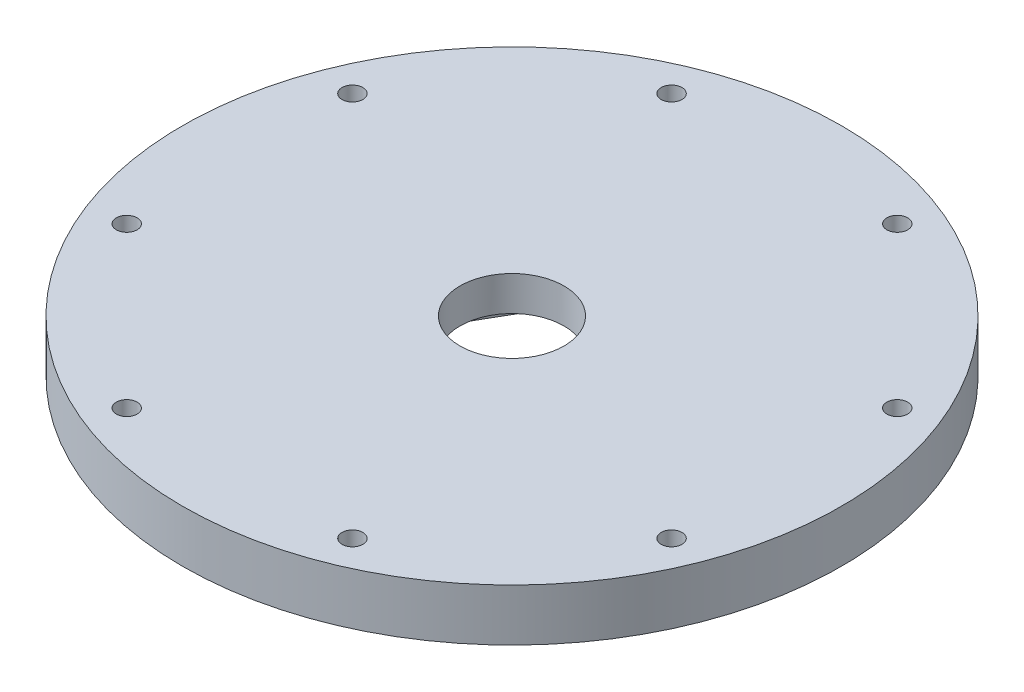
ISO-10303-21;
HEADER;
FILE_DESCRIPTION(('STEP AP214'),'2;1');
FILE_NAME('part.step','',(''),(''),'','','');
FILE_SCHEMA(('AUTOMOTIVE_DESIGN { 1 0 10303 214 1 1 1 1 }'));
ENDSEC;
DATA;
#1=APPLICATION_CONTEXT('core data for automotive mechanical design processes');
#2=APPLICATION_PROTOCOL_DEFINITION('international standard','automotive_design',2000,#1);
#3=PRODUCT_CONTEXT('',#1,'mechanical');
#4=PRODUCT('Part','Part','',(#3));
#5=PRODUCT_RELATED_PRODUCT_CATEGORY('part','',(#4));
#6=PRODUCT_DEFINITION_FORMATION('','',#4);
#7=PRODUCT_DEFINITION_CONTEXT('part definition',#1,'design');
#8=PRODUCT_DEFINITION('design','',#6,#7);
#9=PRODUCT_DEFINITION_SHAPE('','',#8);
#10=(LENGTH_UNIT() NAMED_UNIT(*) SI_UNIT(.MILLI.,.METRE.));
#11=(NAMED_UNIT(*) PLANE_ANGLE_UNIT() SI_UNIT($,.RADIAN.));
#12=(NAMED_UNIT(*) SI_UNIT($,.STERADIAN.) SOLID_ANGLE_UNIT());
#13=UNCERTAINTY_MEASURE_WITH_UNIT(LENGTH_MEASURE(1.E-05),#10,'distance_accuracy_value','');
#14=(GEOMETRIC_REPRESENTATION_CONTEXT(3) GLOBAL_UNCERTAINTY_ASSIGNED_CONTEXT((#13)) GLOBAL_UNIT_ASSIGNED_CONTEXT((#10,
#11,#12)) REPRESENTATION_CONTEXT('',''));
#15=CARTESIAN_POINT('',(0.,0.,0.));
#16=DIRECTION('',(0.,0.,1.));
#17=DIRECTION('',(1.,0.,0.));
#18=AXIS2_PLACEMENT_3D('',#15,#16,#17);
#19=CARTESIAN_POINT('',(0.,7.75,0.));
#20=DIRECTION('',(0.,-1.,0.));
#21=DIRECTION('',(0.,0.,-1.));
#22=AXIS2_PLACEMENT_3D('',#19,#20,#21);
#23=CYLINDRICAL_SURFACE('',#22,47.5);
#24=CARTESIAN_POINT('',(0.,7.75,0.));
#25=DIRECTION('',(0.,1.,0.));
#26=DIRECTION('',(0.,0.,1.));
#27=AXIS2_PLACEMENT_3D('',#24,#25,#26);
#28=CIRCLE('',#27,47.5);
#29=CARTESIAN_POINT('',(0.,7.75,47.5));
#30=VERTEX_POINT('',#29);
#31=EDGE_CURVE('E49',#30,#30,#28,.T.);
#32=ORIENTED_EDGE('',*,*,#31,.F.);
#33=EDGE_LOOP('',(#32));
#34=FACE_BOUND('',#33,.T.);
#35=CARTESIAN_POINT('',(0.,0.25,0.));
#36=DIRECTION('',(0.,-1.,0.));
#37=DIRECTION('',(0.,0.,-1.));
#38=AXIS2_PLACEMENT_3D('',#35,#36,#37);
#39=CIRCLE('',#38,47.5);
#40=CARTESIAN_POINT('',(0.,0.25,-47.5));
#41=VERTEX_POINT('',#40);
#42=EDGE_CURVE('E121',#41,#41,#39,.T.);
#43=ORIENTED_EDGE('',*,*,#42,.F.);
#44=EDGE_LOOP('',(#43));
#45=FACE_BOUND('',#44,.T.);
#46=ADVANCED_FACE('F45',(#34,#45),#23,.T.);
#47=CARTESIAN_POINT('',(0.,7.75,0.));
#48=DIRECTION('',(0.,1.,0.));
#49=DIRECTION('',(0.,0.,1.));
#50=AXIS2_PLACEMENT_3D('',#47,#48,#49);
#51=PLANE('',#50);
#52=CARTESIAN_POINT('',(0.,7.75,0.));
#53=DIRECTION('',(0.,1.,0.));
#54=DIRECTION('',(0.,0.,1.));
#55=AXIS2_PLACEMENT_3D('',#52,#53,#54);
#56=CIRCLE('',#55,7.5);
#57=CARTESIAN_POINT('',(0.,7.75,7.5));
#58=VERTEX_POINT('',#57);
#59=EDGE_CURVE('E306',#58,#58,#56,.T.);
#60=ORIENTED_EDGE('',*,*,#59,.F.);
#61=EDGE_LOOP('',(#60));
#62=FACE_BOUND('',#61,.T.);
#63=CARTESIAN_POINT('',(16.2640458755161,7.75,-39.2648801317298));
#64=DIRECTION('',(0.,1.,0.));
#65=DIRECTION('',(-0.707106781186539,0.,0.707106781186556));
#66=AXIS2_PLACEMENT_3D('',#63,#64,#65);
#67=CIRCLE('',#66,1.5);
#68=CARTESIAN_POINT('',(15.2033857037363,7.75,-38.20421995995));
#69=VERTEX_POINT('',#68);
#70=EDGE_CURVE('E308',#69,#69,#67,.T.);
#71=ORIENTED_EDGE('',*,*,#70,.F.);
#72=EDGE_LOOP('',(#71));
#73=FACE_BOUND('',#72,.T.);
#74=CARTESIAN_POINT('',(39.2648801317296,7.75,-16.2640458755165));
#75=DIRECTION('',(0.,1.,0.));
#76=DIRECTION('',(-1.,0.,0.));
#77=AXIS2_PLACEMENT_3D('',#74,#75,#76);
#78=CIRCLE('',#77,1.5);
#79=CARTESIAN_POINT('',(37.7648801317296,7.75,-16.2640458755165));
#80=VERTEX_POINT('',#79);
#81=EDGE_CURVE('E325',#80,#80,#78,.T.);
#82=ORIENTED_EDGE('',*,*,#81,.F.);
#83=EDGE_LOOP('',(#82));
#84=FACE_BOUND('',#83,.T.);
#85=CARTESIAN_POINT('',(39.2648801317297,7.75,16.2640458755162));
#86=DIRECTION('',(0.,1.,0.));
#87=DIRECTION('',(-0.707106781186554,0.,-0.707106781186541));
#88=AXIS2_PLACEMENT_3D('',#85,#86,#87);
#89=CIRCLE('',#88,1.5);
#90=CARTESIAN_POINT('',(38.2042199599499,7.75,15.2033857037364));
#91=VERTEX_POINT('',#90);
#92=EDGE_CURVE('E316',#91,#91,#89,.T.);
#93=ORIENTED_EDGE('',*,*,#92,.F.);
#94=EDGE_LOOP('',(#93));
#95=FACE_BOUND('',#94,.T.);
#96=CARTESIAN_POINT('',(16.2640458755161,7.75,39.2648801317298));
#97=DIRECTION('',(0.,1.,0.));
#98=DIRECTION('',(0.,0.,-1.));
#99=AXIS2_PLACEMENT_3D('',#96,#97,#98);
#100=CIRCLE('',#99,1.5);
#101=CARTESIAN_POINT('',(16.2640458755161,7.75,37.7648801317298));
#102=VERTEX_POINT('',#101);
#103=EDGE_CURVE('E317',#102,#102,#100,.T.);
#104=ORIENTED_EDGE('',*,*,#103,.F.);
#105=EDGE_LOOP('',(#104));
#106=FACE_BOUND('',#105,.T.);
#107=CARTESIAN_POINT('',(-16.2640458755164,7.75,39.2648801317297));
#108=DIRECTION('',(0.,1.,0.));
#109=DIRECTION('',(0.707106781186544,0.,-0.707106781186551));
#110=AXIS2_PLACEMENT_3D('',#107,#108,#109);
#111=CIRCLE('',#110,1.5);
#112=CARTESIAN_POINT('',(-15.2033857037365,7.75,38.2042199599499));
#113=VERTEX_POINT('',#112);
#114=EDGE_CURVE('E312',#113,#113,#111,.T.);
#115=ORIENTED_EDGE('',*,*,#114,.F.);
#116=EDGE_LOOP('',(#115));
#117=FACE_BOUND('',#116,.T.);
#118=CARTESIAN_POINT('',(-39.2648801317297,7.75,16.2640458755162));
#119=DIRECTION('',(0.,1.,0.));
#120=DIRECTION('',(1.,0.,0.));
#121=AXIS2_PLACEMENT_3D('',#118,#119,#120);
#122=CIRCLE('',#121,1.5);
#123=CARTESIAN_POINT('',(-37.7648801317297,7.75,16.2640458755162));
#124=VERTEX_POINT('',#123);
#125=EDGE_CURVE('E309',#124,#124,#122,.T.);
#126=ORIENTED_EDGE('',*,*,#125,.F.);
#127=EDGE_LOOP('',(#126));
#128=FACE_BOUND('',#127,.T.);
#129=CARTESIAN_POINT('',(-39.2648801317296,7.75,-16.2640458755165));
#130=DIRECTION('',(0.,1.,0.));
#131=DIRECTION('',(0.707106781186549,0.,0.707106781186546));
#132=AXIS2_PLACEMENT_3D('',#129,#130,#131);
#133=CIRCLE('',#132,1.5);
#134=CARTESIAN_POINT('',(-38.2042199599498,7.75,-15.2033857037367));
#135=VERTEX_POINT('',#134);
#136=EDGE_CURVE('E142',#135,#135,#133,.T.);
#137=ORIENTED_EDGE('',*,*,#136,.F.);
#138=EDGE_LOOP('',(#137));
#139=FACE_BOUND('',#138,.T.);
#140=CARTESIAN_POINT('',(-16.2640458755161,7.75,-39.2648801317298));
#141=DIRECTION('',(0.,1.,0.));
#142=DIRECTION('',(0.,0.,1.));
#143=AXIS2_PLACEMENT_3D('',#140,#141,#142);
#144=CIRCLE('',#143,1.5);
#145=CARTESIAN_POINT('',(-16.2640458755161,7.75,-37.7648801317298));
#146=VERTEX_POINT('',#145);
#147=EDGE_CURVE('E138',#146,#146,#144,.T.);
#148=ORIENTED_EDGE('',*,*,#147,.F.);
#149=EDGE_LOOP('',(#148));
#150=FACE_BOUND('',#149,.T.);
#151=ORIENTED_EDGE('',*,*,#31,.T.);
#152=EDGE_LOOP('',(#151));
#153=FACE_BOUND('',#152,.T.);
#154=ADVANCED_FACE('F220',(#62,#73,#84,#95,#106,#117,#128,#139,#150,#153),#51,.T.);
#155=CARTESIAN_POINT('',(0.,0.25,0.));
#156=DIRECTION('',(0.,-1.,0.));
#157=DIRECTION('',(0.,0.,-1.));
#158=AXIS2_PLACEMENT_3D('',#155,#156,#157);
#159=PLANE('',#158);
#160=CARTESIAN_POINT('',(16.2640458755161,0.25,-39.2648801317298));
#161=DIRECTION('',(0.,-1.,0.));
#162=DIRECTION('',(0.,0.,-1.));
#163=AXIS2_PLACEMENT_3D('',#160,#161,#162);
#164=CIRCLE('',#163,1.5);
#165=CARTESIAN_POINT('',(16.2640458755161,0.25,-40.7648801317298));
#166=VERTEX_POINT('',#165);
#167=EDGE_CURVE('E154',#166,#166,#164,.T.);
#168=ORIENTED_EDGE('',*,*,#167,.F.);
#169=EDGE_LOOP('',(#168));
#170=FACE_BOUND('',#169,.T.);
#171=CARTESIAN_POINT('',(39.2648801317296,0.25,-16.2640458755165));
#172=DIRECTION('',(0.,-1.,0.));
#173=DIRECTION('',(0.,0.,-1.));
#174=AXIS2_PLACEMENT_3D('',#171,#172,#173);
#175=CIRCLE('',#174,1.5);
#176=CARTESIAN_POINT('',(39.2648801317296,0.25,-17.7640458755165));
#177=VERTEX_POINT('',#176);
#178=EDGE_CURVE('E153',#177,#177,#175,.T.);
#179=ORIENTED_EDGE('',*,*,#178,.F.);
#180=EDGE_LOOP('',(#179));
#181=FACE_BOUND('',#180,.T.);
#182=CARTESIAN_POINT('',(39.2648801317297,0.25,16.2640458755162));
#183=DIRECTION('',(0.,-1.,0.));
#184=DIRECTION('',(0.,0.,-1.));
#185=AXIS2_PLACEMENT_3D('',#182,#183,#184);
#186=CIRCLE('',#185,1.5);
#187=CARTESIAN_POINT('',(39.2648801317297,0.25,14.7640458755162));
#188=VERTEX_POINT('',#187);
#189=EDGE_CURVE('E148',#188,#188,#186,.T.);
#190=ORIENTED_EDGE('',*,*,#189,.F.);
#191=EDGE_LOOP('',(#190));
#192=FACE_BOUND('',#191,.T.);
#193=CARTESIAN_POINT('',(16.2640458755161,0.25,39.2648801317298));
#194=DIRECTION('',(0.,-1.,0.));
#195=DIRECTION('',(0.,0.,-1.));
#196=AXIS2_PLACEMENT_3D('',#193,#194,#195);
#197=CIRCLE('',#196,1.5);
#198=CARTESIAN_POINT('',(16.2640458755161,0.25,37.7648801317298));
#199=VERTEX_POINT('',#198);
#200=EDGE_CURVE('E150',#199,#199,#197,.T.);
#201=ORIENTED_EDGE('',*,*,#200,.F.);
#202=EDGE_LOOP('',(#201));
#203=FACE_BOUND('',#202,.T.);
#204=CARTESIAN_POINT('',(-16.2640458755164,0.25,39.2648801317297));
#205=DIRECTION('',(0.,-1.,0.));
#206=DIRECTION('',(0.,0.,-1.));
#207=AXIS2_PLACEMENT_3D('',#204,#205,#206);
#208=CIRCLE('',#207,1.5);
#209=CARTESIAN_POINT('',(-16.2640458755164,0.25,37.7648801317297));
#210=VERTEX_POINT('',#209);
#211=EDGE_CURVE('E144',#210,#210,#208,.T.);
#212=ORIENTED_EDGE('',*,*,#211,.F.);
#213=EDGE_LOOP('',(#212));
#214=FACE_BOUND('',#213,.T.);
#215=CARTESIAN_POINT('',(-39.2648801317297,0.25,16.2640458755162));
#216=DIRECTION('',(0.,-1.,0.));
#217=DIRECTION('',(0.,0.,-1.));
#218=AXIS2_PLACEMENT_3D('',#215,#216,#217);
#219=CIRCLE('',#218,1.5);
#220=CARTESIAN_POINT('',(-39.2648801317297,0.25,14.7640458755162));
#221=VERTEX_POINT('',#220);
#222=EDGE_CURVE('E139',#221,#221,#219,.T.);
#223=ORIENTED_EDGE('',*,*,#222,.F.);
#224=EDGE_LOOP('',(#223));
#225=FACE_BOUND('',#224,.T.);
#226=CARTESIAN_POINT('',(-39.2648801317296,0.25,-16.2640458755165));
#227=DIRECTION('',(0.,-1.,0.));
#228=DIRECTION('',(0.,0.,-1.));
#229=AXIS2_PLACEMENT_3D('',#226,#227,#228);
#230=CIRCLE('',#229,1.5);
#231=CARTESIAN_POINT('',(-39.2648801317296,0.25,-17.7640458755165));
#232=VERTEX_POINT('',#231);
#233=EDGE_CURVE('E140',#232,#232,#230,.T.);
#234=ORIENTED_EDGE('',*,*,#233,.F.);
#235=EDGE_LOOP('',(#234));
#236=FACE_BOUND('',#235,.T.);
#237=CARTESIAN_POINT('',(-16.2640458755161,0.25,-39.2648801317298));
#238=DIRECTION('',(0.,-1.,0.));
#239=DIRECTION('',(0.,0.,-1.));
#240=AXIS2_PLACEMENT_3D('',#237,#238,#239);
#241=CIRCLE('',#240,1.5);
#242=CARTESIAN_POINT('',(-16.2640458755161,0.25,-40.7648801317298));
#243=VERTEX_POINT('',#242);
#244=EDGE_CURVE('E135',#243,#243,#241,.T.);
#245=ORIENTED_EDGE('',*,*,#244,.F.);
#246=EDGE_LOOP('',(#245));
#247=FACE_BOUND('',#246,.T.);
#248=CARTESIAN_POINT('',(0.,0.25,0.));
#249=DIRECTION('',(0.,-1.,0.));
#250=DIRECTION('',(0.,0.,-1.));
#251=AXIS2_PLACEMENT_3D('',#248,#249,#250);
#252=CIRCLE('',#251,32.5);
#253=CARTESIAN_POINT('',(0.,0.25,-32.5));
#254=VERTEX_POINT('',#253);
#255=EDGE_CURVE('E122',#254,#254,#252,.T.);
#256=ORIENTED_EDGE('',*,*,#255,.F.);
#257=EDGE_LOOP('',(#256));
#258=FACE_BOUND('',#257,.T.);
#259=ORIENTED_EDGE('',*,*,#42,.T.);
#260=EDGE_LOOP('',(#259));
#261=FACE_BOUND('',#260,.T.);
#262=ADVANCED_FACE('F221',(#170,#181,#192,#203,#214,#225,#236,#247,#258,#261),#159,.T.);
#263=CARTESIAN_POINT('',(0.,0.25,0.));
#264=DIRECTION('',(0.,-1.,0.));
#265=DIRECTION('',(0.,0.,-1.));
#266=AXIS2_PLACEMENT_3D('',#263,#264,#265);
#267=CYLINDRICAL_SURFACE('',#266,32.5);
#268=ORIENTED_EDGE('',*,*,#255,.T.);
#269=EDGE_LOOP('',(#268));
#270=FACE_BOUND('',#269,.T.);
#271=CARTESIAN_POINT('',(0.,-7.75,0.));
#272=DIRECTION('',(0.,-1.,0.));
#273=DIRECTION('',(0.,0.,-1.));
#274=AXIS2_PLACEMENT_3D('',#271,#272,#273);
#275=CIRCLE('',#274,32.5);
#276=CARTESIAN_POINT('',(0.,-7.75,-32.5));
#277=VERTEX_POINT('',#276);
#278=EDGE_CURVE('E123',#277,#277,#275,.T.);
#279=ORIENTED_EDGE('',*,*,#278,.F.);
#280=EDGE_LOOP('',(#279));
#281=FACE_BOUND('',#280,.T.);
#282=ADVANCED_FACE('F233',(#270,#281),#267,.T.);
#283=CARTESIAN_POINT('',(0.,-7.75,0.));
#284=DIRECTION('',(0.,1.,0.));
#285=DIRECTION('',(0.,0.,1.));
#286=AXIS2_PLACEMENT_3D('',#283,#284,#285);
#287=PLANE('',#286);
#288=CARTESIAN_POINT('',(0.,-7.75,0.));
#289=DIRECTION('',(0.,-1.,0.));
#290=DIRECTION('',(0.,0.,-1.));
#291=AXIS2_PLACEMENT_3D('',#288,#289,#290);
#292=CIRCLE('',#291,30.);
#293=CARTESIAN_POINT('',(0.,-7.75,-30.));
#294=VERTEX_POINT('',#293);
#295=EDGE_CURVE('E134',#294,#294,#292,.T.);
#296=ORIENTED_EDGE('',*,*,#295,.F.);
#297=EDGE_LOOP('',(#296));
#298=FACE_BOUND('',#297,.T.);
#299=ORIENTED_EDGE('',*,*,#278,.T.);
#300=EDGE_LOOP('',(#299));
#301=FACE_BOUND('',#300,.T.);
#302=ADVANCED_FACE('F238',(#298,#301),#287,.F.);
#303=CARTESIAN_POINT('',(0.,-1.75,0.));
#304=DIRECTION('',(0.,-1.,0.));
#305=DIRECTION('',(0.,0.,-1.));
#306=AXIS2_PLACEMENT_3D('',#303,#304,#305);
#307=PLANE('',#306);
#308=CARTESIAN_POINT('',(0.,-1.75,0.));
#309=DIRECTION('',(0.,-1.,0.));
#310=DIRECTION('',(0.,0.,-1.));
#311=AXIS2_PLACEMENT_3D('',#308,#309,#310);
#312=CIRCLE('',#311,30.);
#313=CARTESIAN_POINT('',(0.,-1.75,-30.));
#314=VERTEX_POINT('',#313);
#315=EDGE_CURVE('E168',#314,#314,#312,.T.);
#316=ORIENTED_EDGE('',*,*,#315,.T.);
#317=EDGE_LOOP('',(#316));
#318=FACE_BOUND('',#317,.T.);
#319=DIRECTION('',(-0.5,0.,-0.866025403784439));
#320=VECTOR('',#319,1.);
#321=CARTESIAN_POINT('',(7.625,-1.75,-13.2068874077127));
#322=LINE('',#321,#320);
#323=CARTESIAN_POINT('',(15.25,-1.75,0.));
#324=VERTEX_POINT('',#323);
#325=CARTESIAN_POINT('',(7.625,-1.75,-13.2068874077127));
#326=VERTEX_POINT('',#325);
#327=EDGE_CURVE('E98',#324,#326,#322,.T.);
#328=ORIENTED_EDGE('',*,*,#327,.T.);
#329=DIRECTION('',(-1.,0.,0.));
#330=VECTOR('',#329,1.);
#331=CARTESIAN_POINT('',(-7.62499999999999,-1.75,-13.2068874077127));
#332=LINE('',#331,#330);
#333=CARTESIAN_POINT('',(-7.62499999999998,-1.75,-13.2068874077127));
#334=VERTEX_POINT('',#333);
#335=EDGE_CURVE('E102',#326,#334,#332,.T.);
#336=ORIENTED_EDGE('',*,*,#335,.T.);
#337=DIRECTION('',(-0.5,0.,0.866025403784438));
#338=VECTOR('',#337,1.);
#339=CARTESIAN_POINT('',(-15.25,-1.75,0.));
#340=LINE('',#339,#338);
#341=CARTESIAN_POINT('',(-15.25,-1.75,0.));
#342=VERTEX_POINT('',#341);
#343=EDGE_CURVE('E172',#334,#342,#340,.T.);
#344=ORIENTED_EDGE('',*,*,#343,.T.);
#345=DIRECTION('',(0.5,0.,0.866025403784439));
#346=VECTOR('',#345,1.);
#347=CARTESIAN_POINT('',(-7.625,-1.75,13.2068874077127));
#348=LINE('',#347,#346);
#349=CARTESIAN_POINT('',(-7.625,-1.75,13.2068874077127));
#350=VERTEX_POINT('',#349);
#351=EDGE_CURVE('E175',#342,#350,#348,.T.);
#352=ORIENTED_EDGE('',*,*,#351,.T.);
#353=DIRECTION('',(1.,0.,0.));
#354=VECTOR('',#353,1.);
#355=CARTESIAN_POINT('',(7.625,-1.75,13.2068874077127));
#356=LINE('',#355,#354);
#357=CARTESIAN_POINT('',(7.625,-1.75,13.2068874077127));
#358=VERTEX_POINT('',#357);
#359=EDGE_CURVE('E60',#350,#358,#356,.T.);
#360=ORIENTED_EDGE('',*,*,#359,.T.);
#361=DIRECTION('',(0.5,0.,-0.866025403784439));
#362=VECTOR('',#361,1.);
#363=CARTESIAN_POINT('',(15.25,-1.75,0.));
#364=LINE('',#363,#362);
#365=EDGE_CURVE('E12',#358,#324,#364,.T.);
#366=ORIENTED_EDGE('',*,*,#365,.T.);
#367=EDGE_LOOP('',(#328,#336,#344,#352,#360,#366));
#368=FACE_BOUND('',#367,.T.);
#369=ADVANCED_FACE('F94',(#318,#368),#307,.T.);
#370=CARTESIAN_POINT('',(0.,-1.75,0.));
#371=DIRECTION('',(0.,-1.,0.));
#372=DIRECTION('',(0.,0.,-1.));
#373=AXIS2_PLACEMENT_3D('',#370,#371,#372);
#374=CYLINDRICAL_SURFACE('',#373,30.);
#375=ORIENTED_EDGE('',*,*,#315,.F.);
#376=EDGE_LOOP('',(#375));
#377=FACE_BOUND('',#376,.T.);
#378=ORIENTED_EDGE('',*,*,#295,.T.);
#379=EDGE_LOOP('',(#378));
#380=FACE_BOUND('',#379,.T.);
#381=ADVANCED_FACE('F247',(#377,#380),#374,.F.);
#382=CARTESIAN_POINT('',(0.,2.75,0.));
#383=DIRECTION('',(0.,-1.,0.));
#384=DIRECTION('',(0.,0.,-1.));
#385=AXIS2_PLACEMENT_3D('',#382,#383,#384);
#386=PLANE('',#385);
#387=CARTESIAN_POINT('',(0.,2.75,0.));
#388=DIRECTION('',(0.,-1.,0.));
#389=DIRECTION('',(0.,0.,-1.));
#390=AXIS2_PLACEMENT_3D('',#387,#388,#389);
#391=CIRCLE('',#390,7.5);
#392=CARTESIAN_POINT('',(0.,2.75,-7.5));
#393=VERTEX_POINT('',#392);
#394=EDGE_CURVE('E44',#393,#393,#391,.T.);
#395=ORIENTED_EDGE('',*,*,#394,.F.);
#396=EDGE_LOOP('',(#395));
#397=FACE_BOUND('',#396,.T.);
#398=DIRECTION('',(0.499999999999999,0.,0.866025403784439));
#399=VECTOR('',#398,1.);
#400=CARTESIAN_POINT('',(7.625,2.75,-13.2068874077127));
#401=LINE('',#400,#399);
#402=CARTESIAN_POINT('',(7.625,2.75,-13.2068874077127));
#403=VERTEX_POINT('',#402);
#404=CARTESIAN_POINT('',(15.25,2.75,0.));
#405=VERTEX_POINT('',#404);
#406=EDGE_CURVE('E104',#403,#405,#401,.T.);
#407=ORIENTED_EDGE('',*,*,#406,.T.);
#408=DIRECTION('',(-0.5,0.,0.866025403784439));
#409=VECTOR('',#408,1.);
#410=CARTESIAN_POINT('',(15.25,2.75,0.));
#411=LINE('',#410,#409);
#412=CARTESIAN_POINT('',(7.625,2.75,13.2068874077127));
#413=VERTEX_POINT('',#412);
#414=EDGE_CURVE('E107',#405,#413,#411,.T.);
#415=ORIENTED_EDGE('',*,*,#414,.T.);
#416=DIRECTION('',(-1.,0.,0.));
#417=VECTOR('',#416,1.);
#418=CARTESIAN_POINT('',(7.625,2.75,13.2068874077127));
#419=LINE('',#418,#417);
#420=CARTESIAN_POINT('',(-7.625,2.75,13.2068874077127));
#421=VERTEX_POINT('',#420);
#422=EDGE_CURVE('E177',#413,#421,#419,.T.);
#423=ORIENTED_EDGE('',*,*,#422,.T.);
#424=DIRECTION('',(-0.5,0.,-0.866025403784439));
#425=VECTOR('',#424,1.);
#426=CARTESIAN_POINT('',(-7.625,2.75,13.2068874077127));
#427=LINE('',#426,#425);
#428=CARTESIAN_POINT('',(-15.25,2.75,0.));
#429=VERTEX_POINT('',#428);
#430=EDGE_CURVE('E185',#421,#429,#427,.T.);
#431=ORIENTED_EDGE('',*,*,#430,.T.);
#432=DIRECTION('',(0.5,0.,-0.866025403784438));
#433=VECTOR('',#432,1.);
#434=CARTESIAN_POINT('',(-15.25,2.75,0.));
#435=LINE('',#434,#433);
#436=CARTESIAN_POINT('',(-7.62499999999999,2.75,-13.2068874077127));
#437=VERTEX_POINT('',#436);
#438=EDGE_CURVE('E120',#429,#437,#435,.T.);
#439=ORIENTED_EDGE('',*,*,#438,.T.);
#440=DIRECTION('',(1.,0.,0.));
#441=VECTOR('',#440,1.);
#442=CARTESIAN_POINT('',(-7.62499999999999,2.75,-13.2068874077127));
#443=LINE('',#442,#441);
#444=EDGE_CURVE('E115',#437,#403,#443,.T.);
#445=ORIENTED_EDGE('',*,*,#444,.T.);
#446=EDGE_LOOP('',(#407,#415,#423,#431,#439,#445));
#447=FACE_BOUND('',#446,.T.);
#448=ADVANCED_FACE('F205',(#397,#447),#386,.T.);
#449=CARTESIAN_POINT('',(15.25,2.75,0.));
#450=DIRECTION('',(0.866025403784439,0.,0.5));
#451=DIRECTION('',(0.5,0.,-0.866025403784439));
#452=AXIS2_PLACEMENT_3D('',#449,#450,#451);
#453=PLANE('',#452);
#454=ORIENTED_EDGE('',*,*,#365,.F.);
#455=DIRECTION('',(0.,-1.,0.));
#456=VECTOR('',#455,1.);
#457=CARTESIAN_POINT('',(7.625,2.75,13.2068874077127));
#458=LINE('',#457,#456);
#459=EDGE_CURVE('E111',#413,#358,#458,.T.);
#460=ORIENTED_EDGE('',*,*,#459,.F.);
#461=ORIENTED_EDGE('',*,*,#414,.F.);
#462=DIRECTION('',(0.,-1.,0.));
#463=VECTOR('',#462,1.);
#464=CARTESIAN_POINT('',(15.25,2.75,0.));
#465=LINE('',#464,#463);
#466=EDGE_CURVE('E105',#405,#324,#465,.T.);
#467=ORIENTED_EDGE('',*,*,#466,.T.);
#468=EDGE_LOOP('',(#454,#460,#461,#467));
#469=FACE_BOUND('',#468,.T.);
#470=ADVANCED_FACE('F110',(#469),#453,.F.);
#471=CARTESIAN_POINT('',(7.625,2.75,13.2068874077127));
#472=DIRECTION('',(0.,0.,1.));
#473=DIRECTION('',(1.,0.,0.));
#474=AXIS2_PLACEMENT_3D('',#471,#472,#473);
#475=PLANE('',#474);
#476=ORIENTED_EDGE('',*,*,#359,.F.);
#477=DIRECTION('',(0.,-1.,0.));
#478=VECTOR('',#477,1.);
#479=CARTESIAN_POINT('',(-7.625,2.75,13.2068874077127));
#480=LINE('',#479,#478);
#481=EDGE_CURVE('E112',#421,#350,#480,.T.);
#482=ORIENTED_EDGE('',*,*,#481,.F.);
#483=ORIENTED_EDGE('',*,*,#422,.F.);
#484=ORIENTED_EDGE('',*,*,#459,.T.);
#485=EDGE_LOOP('',(#476,#482,#483,#484));
#486=FACE_BOUND('',#485,.T.);
#487=ADVANCED_FACE('F199',(#486),#475,.F.);
#488=CARTESIAN_POINT('',(-7.625,2.75,13.2068874077127));
#489=DIRECTION('',(-0.866025403784439,0.,0.5));
#490=DIRECTION('',(0.5,0.,0.866025403784439));
#491=AXIS2_PLACEMENT_3D('',#488,#489,#490);
#492=PLANE('',#491);
#493=ORIENTED_EDGE('',*,*,#351,.F.);
#494=DIRECTION('',(0.,-1.,0.));
#495=VECTOR('',#494,1.);
#496=CARTESIAN_POINT('',(-15.25,2.75,0.));
#497=LINE('',#496,#495);
#498=EDGE_CURVE('E192',#429,#342,#497,.T.);
#499=ORIENTED_EDGE('',*,*,#498,.F.);
#500=ORIENTED_EDGE('',*,*,#430,.F.);
#501=ORIENTED_EDGE('',*,*,#481,.T.);
#502=EDGE_LOOP('',(#493,#499,#500,#501));
#503=FACE_BOUND('',#502,.T.);
#504=ADVANCED_FACE('F200',(#503),#492,.F.);
#505=CARTESIAN_POINT('',(-15.25,2.75,0.));
#506=DIRECTION('',(-0.866025403784438,0.,-0.5));
#507=DIRECTION('',(-0.5,0.,0.866025403784438));
#508=AXIS2_PLACEMENT_3D('',#505,#506,#507);
#509=PLANE('',#508);
#510=ORIENTED_EDGE('',*,*,#343,.F.);
#511=DIRECTION('',(0.,-1.,0.));
#512=VECTOR('',#511,1.);
#513=CARTESIAN_POINT('',(-7.62499999999999,2.75,-13.2068874077127));
#514=LINE('',#513,#512);
#515=EDGE_CURVE('E189',#437,#334,#514,.T.);
#516=ORIENTED_EDGE('',*,*,#515,.F.);
#517=ORIENTED_EDGE('',*,*,#438,.F.);
#518=ORIENTED_EDGE('',*,*,#498,.T.);
#519=EDGE_LOOP('',(#510,#516,#517,#518));
#520=FACE_BOUND('',#519,.T.);
#521=ADVANCED_FACE('F210',(#520),#509,.F.);
#522=CARTESIAN_POINT('',(-7.62499999999999,2.75,-13.2068874077127));
#523=DIRECTION('',(0.,0.,-1.));
#524=DIRECTION('',(-1.,0.,0.));
#525=AXIS2_PLACEMENT_3D('',#522,#523,#524);
#526=PLANE('',#525);
#527=ORIENTED_EDGE('',*,*,#335,.F.);
#528=DIRECTION('',(0.,-1.,0.));
#529=VECTOR('',#528,1.);
#530=CARTESIAN_POINT('',(7.625,2.75,-13.2068874077127));
#531=LINE('',#530,#529);
#532=EDGE_CURVE('E63',#403,#326,#531,.T.);
#533=ORIENTED_EDGE('',*,*,#532,.F.);
#534=ORIENTED_EDGE('',*,*,#444,.F.);
#535=ORIENTED_EDGE('',*,*,#515,.T.);
#536=EDGE_LOOP('',(#527,#533,#534,#535));
#537=FACE_BOUND('',#536,.T.);
#538=ADVANCED_FACE('F202',(#537),#526,.F.);
#539=CARTESIAN_POINT('',(7.625,2.75,-13.2068874077127));
#540=DIRECTION('',(0.866025403784439,0.,-0.5));
#541=DIRECTION('',(-0.5,0.,-0.866025403784439));
#542=AXIS2_PLACEMENT_3D('',#539,#540,#541);
#543=PLANE('',#542);
#544=ORIENTED_EDGE('',*,*,#327,.F.);
#545=ORIENTED_EDGE('',*,*,#466,.F.);
#546=ORIENTED_EDGE('',*,*,#406,.F.);
#547=ORIENTED_EDGE('',*,*,#532,.T.);
#548=EDGE_LOOP('',(#544,#545,#546,#547));
#549=FACE_BOUND('',#548,.T.);
#550=ADVANCED_FACE('F103',(#549),#543,.F.);
#551=CARTESIAN_POINT('',(-16.2640458755161,-7.75,-39.2648801317298));
#552=DIRECTION('',(0.,1.,0.));
#553=DIRECTION('',(0.,0.,1.));
#554=AXIS2_PLACEMENT_3D('',#551,#552,#553);
#555=CYLINDRICAL_SURFACE('',#554,1.5);
#556=ORIENTED_EDGE('',*,*,#244,.T.);
#557=EDGE_LOOP('',(#556));
#558=FACE_BOUND('',#557,.T.);
#559=ORIENTED_EDGE('',*,*,#147,.T.);
#560=EDGE_LOOP('',(#559));
#561=FACE_BOUND('',#560,.T.);
#562=ADVANCED_FACE('F270',(#558,#561),#555,.F.);
#563=CARTESIAN_POINT('',(-39.2648801317296,-7.75,-16.2640458755165));
#564=DIRECTION('',(0.,1.,0.));
#565=DIRECTION('',(0.,0.,1.));
#566=AXIS2_PLACEMENT_3D('',#563,#564,#565);
#567=CYLINDRICAL_SURFACE('',#566,1.5);
#568=ORIENTED_EDGE('',*,*,#233,.T.);
#569=EDGE_LOOP('',(#568));
#570=FACE_BOUND('',#569,.T.);
#571=ORIENTED_EDGE('',*,*,#136,.T.);
#572=EDGE_LOOP('',(#571));
#573=FACE_BOUND('',#572,.T.);
#574=ADVANCED_FACE('F267',(#570,#573),#567,.F.);
#575=CARTESIAN_POINT('',(-39.2648801317297,-7.75,16.2640458755162));
#576=DIRECTION('',(0.,1.,0.));
#577=DIRECTION('',(0.,0.,1.));
#578=AXIS2_PLACEMENT_3D('',#575,#576,#577);
#579=CYLINDRICAL_SURFACE('',#578,1.5);
#580=ORIENTED_EDGE('',*,*,#222,.T.);
#581=EDGE_LOOP('',(#580));
#582=FACE_BOUND('',#581,.T.);
#583=ORIENTED_EDGE('',*,*,#125,.T.);
#584=EDGE_LOOP('',(#583));
#585=FACE_BOUND('',#584,.T.);
#586=ADVANCED_FACE('F275',(#582,#585),#579,.F.);
#587=CARTESIAN_POINT('',(-16.2640458755164,-7.75,39.2648801317297));
#588=DIRECTION('',(0.,1.,0.));
#589=DIRECTION('',(0.,0.,1.));
#590=AXIS2_PLACEMENT_3D('',#587,#588,#589);
#591=CYLINDRICAL_SURFACE('',#590,1.5);
#592=ORIENTED_EDGE('',*,*,#211,.T.);
#593=EDGE_LOOP('',(#592));
#594=FACE_BOUND('',#593,.T.);
#595=ORIENTED_EDGE('',*,*,#114,.T.);
#596=EDGE_LOOP('',(#595));
#597=FACE_BOUND('',#596,.T.);
#598=ADVANCED_FACE('F287',(#594,#597),#591,.F.);
#599=CARTESIAN_POINT('',(16.2640458755161,-7.75,39.2648801317298));
#600=DIRECTION('',(0.,1.,0.));
#601=DIRECTION('',(0.,0.,1.));
#602=AXIS2_PLACEMENT_3D('',#599,#600,#601);
#603=CYLINDRICAL_SURFACE('',#602,1.5);
#604=ORIENTED_EDGE('',*,*,#200,.T.);
#605=EDGE_LOOP('',(#604));
#606=FACE_BOUND('',#605,.T.);
#607=ORIENTED_EDGE('',*,*,#103,.T.);
#608=EDGE_LOOP('',(#607));
#609=FACE_BOUND('',#608,.T.);
#610=ADVANCED_FACE('F284',(#606,#609),#603,.F.);
#611=CARTESIAN_POINT('',(39.2648801317297,-7.75,16.2640458755162));
#612=DIRECTION('',(0.,1.,0.));
#613=DIRECTION('',(0.,0.,1.));
#614=AXIS2_PLACEMENT_3D('',#611,#612,#613);
#615=CYLINDRICAL_SURFACE('',#614,1.5);
#616=ORIENTED_EDGE('',*,*,#189,.T.);
#617=EDGE_LOOP('',(#616));
#618=FACE_BOUND('',#617,.T.);
#619=ORIENTED_EDGE('',*,*,#92,.T.);
#620=EDGE_LOOP('',(#619));
#621=FACE_BOUND('',#620,.T.);
#622=ADVANCED_FACE('F281',(#618,#621),#615,.F.);
#623=CARTESIAN_POINT('',(39.2648801317296,-7.75,-16.2640458755165));
#624=DIRECTION('',(0.,1.,0.));
#625=DIRECTION('',(0.,0.,1.));
#626=AXIS2_PLACEMENT_3D('',#623,#624,#625);
#627=CYLINDRICAL_SURFACE('',#626,1.5);
#628=ORIENTED_EDGE('',*,*,#178,.T.);
#629=EDGE_LOOP('',(#628));
#630=FACE_BOUND('',#629,.T.);
#631=ORIENTED_EDGE('',*,*,#81,.T.);
#632=EDGE_LOOP('',(#631));
#633=FACE_BOUND('',#632,.T.);
#634=ADVANCED_FACE('F279',(#630,#633),#627,.F.);
#635=CARTESIAN_POINT('',(16.2640458755161,-7.75,-39.2648801317298));
#636=DIRECTION('',(0.,1.,0.));
#637=DIRECTION('',(0.,0.,1.));
#638=AXIS2_PLACEMENT_3D('',#635,#636,#637);
#639=CYLINDRICAL_SURFACE('',#638,1.5);
#640=ORIENTED_EDGE('',*,*,#167,.T.);
#641=EDGE_LOOP('',(#640));
#642=FACE_BOUND('',#641,.T.);
#643=ORIENTED_EDGE('',*,*,#70,.T.);
#644=EDGE_LOOP('',(#643));
#645=FACE_BOUND('',#644,.T.);
#646=ADVANCED_FACE('F274',(#642,#645),#639,.F.);
#647=CARTESIAN_POINT('',(0.,-7.75,0.));
#648=DIRECTION('',(0.,1.,0.));
#649=DIRECTION('',(0.,0.,1.));
#650=AXIS2_PLACEMENT_3D('',#647,#648,#649);
#651=CYLINDRICAL_SURFACE('',#650,7.5);
#652=ORIENTED_EDGE('',*,*,#394,.T.);
#653=EDGE_LOOP('',(#652));
#654=FACE_BOUND('',#653,.T.);
#655=ORIENTED_EDGE('',*,*,#59,.T.);
#656=EDGE_LOOP('',(#655));
#657=FACE_BOUND('',#656,.T.);
#658=ADVANCED_FACE('F280',(#654,#657),#651,.F.);
#659=CLOSED_SHELL('',(#46,#154,#262,#282,#302,#369,#381,#448,#470,#487,#504,#521,#538,#550,#562,
#574,#586,#598,#610,#622,#634,#646,#658));
#660=MANIFOLD_SOLID_BREP('B2',#659);
#661=ADVANCED_BREP_SHAPE_REPRESENTATION('',(#18,#660),#14);
#662=SHAPE_DEFINITION_REPRESENTATION(#9,#661);
ENDSEC;
END-ISO-10303-21;
